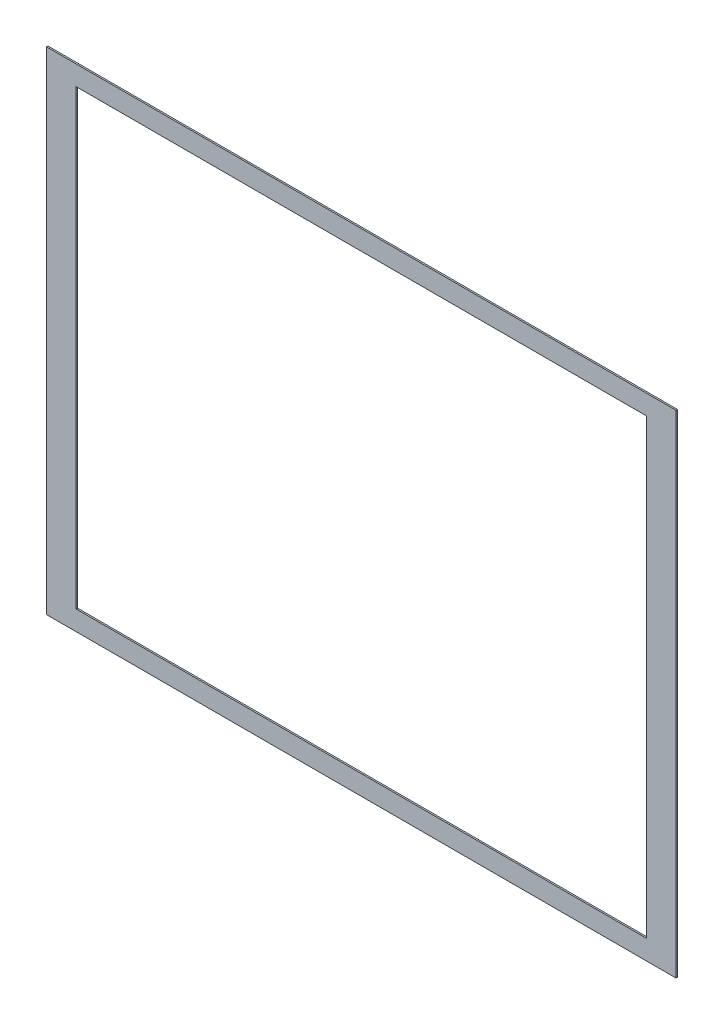
ISO-10303-21;
HEADER;
FILE_DESCRIPTION(('STEP AP214'),'2;1');
FILE_NAME('part.step','',(''),(''),'','','');
FILE_SCHEMA(('AUTOMOTIVE_DESIGN { 1 0 10303 214 1 1 1 1 }'));
ENDSEC;
DATA;
#1=APPLICATION_CONTEXT('core data for automotive mechanical design processes');
#2=APPLICATION_PROTOCOL_DEFINITION('international standard','automotive_design',2000,#1);
#3=PRODUCT_CONTEXT('',#1,'mechanical');
#4=PRODUCT('Part','Part','',(#3));
#5=PRODUCT_RELATED_PRODUCT_CATEGORY('part','',(#4));
#6=PRODUCT_DEFINITION_FORMATION('','',#4);
#7=PRODUCT_DEFINITION_CONTEXT('part definition',#1,'design');
#8=PRODUCT_DEFINITION('design','',#6,#7);
#9=PRODUCT_DEFINITION_SHAPE('','',#8);
#10=(LENGTH_UNIT() NAMED_UNIT(*) SI_UNIT(.MILLI.,.METRE.));
#11=(NAMED_UNIT(*) PLANE_ANGLE_UNIT() SI_UNIT($,.RADIAN.));
#12=(NAMED_UNIT(*) SI_UNIT($,.STERADIAN.) SOLID_ANGLE_UNIT());
#13=UNCERTAINTY_MEASURE_WITH_UNIT(LENGTH_MEASURE(1.E-05),#10,'distance_accuracy_value','');
#14=(GEOMETRIC_REPRESENTATION_CONTEXT(3) GLOBAL_UNCERTAINTY_ASSIGNED_CONTEXT((#13)) GLOBAL_UNIT_ASSIGNED_CONTEXT((#10,
#11,#12)) REPRESENTATION_CONTEXT('',''));
#15=CARTESIAN_POINT('',(0.,0.,0.));
#16=DIRECTION('',(0.,0.,1.));
#17=DIRECTION('',(1.,0.,0.));
#18=AXIS2_PLACEMENT_3D('',#15,#16,#17);
#19=CARTESIAN_POINT('',(0.,0.,40.));
#20=DIRECTION('',(0.,0.,-1.));
#21=DIRECTION('',(-1.,0.,0.));
#22=AXIS2_PLACEMENT_3D('',#19,#20,#21);
#23=PLANE('',#22);
#24=DIRECTION('',(0.,-1.,0.));
#25=VECTOR('',#24,1.);
#26=CARTESIAN_POINT('',(30.,320.,40.));
#27=LINE('',#26,#25);
#28=CARTESIAN_POINT('',(30.,820.,40.));
#29=VERTEX_POINT('',#28);
#30=CARTESIAN_POINT('',(30.,320.,40.));
#31=VERTEX_POINT('',#30);
#32=EDGE_CURVE('E126',#29,#31,#27,.T.);
#33=ORIENTED_EDGE('',*,*,#32,.T.);
#34=DIRECTION('',(1.,0.,0.));
#35=VECTOR('',#34,1.);
#36=CARTESIAN_POINT('',(30.,320.,40.));
#37=LINE('',#36,#35);
#38=CARTESIAN_POINT('',(670.,320.,40.));
#39=VERTEX_POINT('',#38);
#40=EDGE_CURVE('E129',#31,#39,#37,.T.);
#41=ORIENTED_EDGE('',*,*,#40,.T.);
#42=DIRECTION('',(0.,1.,0.));
#43=VECTOR('',#42,1.);
#44=CARTESIAN_POINT('',(670.,320.,40.));
#45=LINE('',#44,#43);
#46=CARTESIAN_POINT('',(670.,820.,40.));
#47=VERTEX_POINT('',#46);
#48=EDGE_CURVE('E132',#39,#47,#45,.T.);
#49=ORIENTED_EDGE('',*,*,#48,.T.);
#50=DIRECTION('',(-1.,0.,0.));
#51=VECTOR('',#50,1.);
#52=CARTESIAN_POINT('',(30.,820.,40.));
#53=LINE('',#52,#51);
#54=EDGE_CURVE('E134',#47,#29,#53,.T.);
#55=ORIENTED_EDGE('',*,*,#54,.T.);
#56=EDGE_LOOP('',(#33,#41,#49,#55));
#57=FACE_BOUND('',#56,.T.);
#58=DIRECTION('',(0.,-1.,0.));
#59=VECTOR('',#58,1.);
#60=CARTESIAN_POINT('',(60.,0.,40.));
#61=LINE('',#60,#59);
#62=CARTESIAN_POINT('',(60.,800.,40.));
#63=VERTEX_POINT('',#62);
#64=CARTESIAN_POINT('',(60.,340.,40.));
#65=VERTEX_POINT('',#64);
#66=EDGE_CURVE('E112',#63,#65,#61,.T.);
#67=ORIENTED_EDGE('',*,*,#66,.F.);
#68=DIRECTION('',(-1.,0.,0.));
#69=VECTOR('',#68,1.);
#70=CARTESIAN_POINT('',(0.,800.,40.));
#71=LINE('',#70,#69);
#72=CARTESIAN_POINT('',(640.,800.,40.));
#73=VERTEX_POINT('',#72);
#74=EDGE_CURVE('E101',#73,#63,#71,.T.);
#75=ORIENTED_EDGE('',*,*,#74,.F.);
#76=DIRECTION('',(0.,1.,0.));
#77=VECTOR('',#76,1.);
#78=CARTESIAN_POINT('',(640.,0.,40.));
#79=LINE('',#78,#77);
#80=CARTESIAN_POINT('',(640.,340.,40.));
#81=VERTEX_POINT('',#80);
#82=EDGE_CURVE('E106',#81,#73,#79,.T.);
#83=ORIENTED_EDGE('',*,*,#82,.F.);
#84=DIRECTION('',(1.,0.,0.));
#85=VECTOR('',#84,1.);
#86=CARTESIAN_POINT('',(0.,340.,40.));
#87=LINE('',#86,#85);
#88=EDGE_CURVE('E117',#65,#81,#87,.T.);
#89=ORIENTED_EDGE('',*,*,#88,.F.);
#90=EDGE_LOOP('',(#67,#75,#83,#89));
#91=FACE_BOUND('',#90,.T.);
#92=ADVANCED_FACE('F39',(#57,#91),#23,.F.);
#93=CARTESIAN_POINT('',(0.,0.,38.5));
#94=DIRECTION('',(0.,0.,-1.));
#95=DIRECTION('',(-1.,0.,0.));
#96=AXIS2_PLACEMENT_3D('',#93,#94,#95);
#97=PLANE('',#96);
#98=DIRECTION('',(0.,-1.,0.));
#99=VECTOR('',#98,1.);
#100=CARTESIAN_POINT('',(30.,320.,38.5));
#101=LINE('',#100,#99);
#102=CARTESIAN_POINT('',(30.,820.,38.5));
#103=VERTEX_POINT('',#102);
#104=CARTESIAN_POINT('',(30.,320.,38.5));
#105=VERTEX_POINT('',#104);
#106=EDGE_CURVE('E118',#103,#105,#101,.T.);
#107=ORIENTED_EDGE('',*,*,#106,.F.);
#108=DIRECTION('',(-1.,0.,0.));
#109=VECTOR('',#108,1.);
#110=CARTESIAN_POINT('',(30.,820.,38.5));
#111=LINE('',#110,#109);
#112=CARTESIAN_POINT('',(670.,820.,38.5));
#113=VERTEX_POINT('',#112);
#114=EDGE_CURVE('E130',#113,#103,#111,.T.);
#115=ORIENTED_EDGE('',*,*,#114,.F.);
#116=DIRECTION('',(0.,1.,0.));
#117=VECTOR('',#116,1.);
#118=CARTESIAN_POINT('',(670.,320.,38.5));
#119=LINE('',#118,#117);
#120=CARTESIAN_POINT('',(670.,320.,38.5));
#121=VERTEX_POINT('',#120);
#122=EDGE_CURVE('E138',#121,#113,#119,.T.);
#123=ORIENTED_EDGE('',*,*,#122,.F.);
#124=DIRECTION('',(1.,0.,0.));
#125=VECTOR('',#124,1.);
#126=CARTESIAN_POINT('',(30.,320.,38.5));
#127=LINE('',#126,#125);
#128=EDGE_CURVE('E121',#105,#121,#127,.T.);
#129=ORIENTED_EDGE('',*,*,#128,.F.);
#130=EDGE_LOOP('',(#107,#115,#123,#129));
#131=FACE_BOUND('',#130,.T.);
#132=DIRECTION('',(-1.,0.,0.));
#133=VECTOR('',#132,1.);
#134=CARTESIAN_POINT('',(0.,800.,38.5));
#135=LINE('',#134,#133);
#136=CARTESIAN_POINT('',(640.,800.,38.5));
#137=VERTEX_POINT('',#136);
#138=CARTESIAN_POINT('',(60.,800.,38.5));
#139=VERTEX_POINT('',#138);
#140=EDGE_CURVE('E152',#137,#139,#135,.T.);
#141=ORIENTED_EDGE('',*,*,#140,.T.);
#142=DIRECTION('',(0.,-1.,0.));
#143=VECTOR('',#142,1.);
#144=CARTESIAN_POINT('',(60.,0.,38.5));
#145=LINE('',#144,#143);
#146=CARTESIAN_POINT('',(60.,340.,38.5));
#147=VERTEX_POINT('',#146);
#148=EDGE_CURVE('E11',#139,#147,#145,.T.);
#149=ORIENTED_EDGE('',*,*,#148,.T.);
#150=DIRECTION('',(1.,0.,0.));
#151=VECTOR('',#150,1.);
#152=CARTESIAN_POINT('',(0.,340.,38.5));
#153=LINE('',#152,#151);
#154=CARTESIAN_POINT('',(640.,340.,38.5));
#155=VERTEX_POINT('',#154);
#156=EDGE_CURVE('E47',#147,#155,#153,.T.);
#157=ORIENTED_EDGE('',*,*,#156,.T.);
#158=DIRECTION('',(0.,1.,0.));
#159=VECTOR('',#158,1.);
#160=CARTESIAN_POINT('',(640.,0.,38.5));
#161=LINE('',#160,#159);
#162=EDGE_CURVE('E154',#155,#137,#161,.T.);
#163=ORIENTED_EDGE('',*,*,#162,.T.);
#164=EDGE_LOOP('',(#141,#149,#157,#163));
#165=FACE_BOUND('',#164,.T.);
#166=ADVANCED_FACE('F158',(#131,#165),#97,.T.);
#167=CARTESIAN_POINT('',(30.,320.,40.));
#168=DIRECTION('',(1.,0.,0.));
#169=DIRECTION('',(0.,0.,-1.));
#170=AXIS2_PLACEMENT_3D('',#167,#168,#169);
#171=PLANE('',#170);
#172=ORIENTED_EDGE('',*,*,#106,.T.);
#173=DIRECTION('',(0.,0.,-1.));
#174=VECTOR('',#173,1.);
#175=CARTESIAN_POINT('',(30.,320.,40.));
#176=LINE('',#175,#174);
#177=EDGE_CURVE('E149',#31,#105,#176,.T.);
#178=ORIENTED_EDGE('',*,*,#177,.F.);
#179=ORIENTED_EDGE('',*,*,#32,.F.);
#180=DIRECTION('',(0.,0.,-1.));
#181=VECTOR('',#180,1.);
#182=CARTESIAN_POINT('',(30.,820.,40.));
#183=LINE('',#182,#181);
#184=EDGE_CURVE('E135',#29,#103,#183,.T.);
#185=ORIENTED_EDGE('',*,*,#184,.T.);
#186=EDGE_LOOP('',(#172,#178,#179,#185));
#187=FACE_BOUND('',#186,.T.);
#188=ADVANCED_FACE('F41',(#187),#171,.F.);
#189=CARTESIAN_POINT('',(30.,320.,40.));
#190=DIRECTION('',(0.,1.,0.));
#191=DIRECTION('',(0.,0.,1.));
#192=AXIS2_PLACEMENT_3D('',#189,#190,#191);
#193=PLANE('',#192);
#194=ORIENTED_EDGE('',*,*,#128,.T.);
#195=DIRECTION('',(0.,0.,-1.));
#196=VECTOR('',#195,1.);
#197=CARTESIAN_POINT('',(670.,320.,40.));
#198=LINE('',#197,#196);
#199=EDGE_CURVE('E146',#39,#121,#198,.T.);
#200=ORIENTED_EDGE('',*,*,#199,.F.);
#201=ORIENTED_EDGE('',*,*,#40,.F.);
#202=ORIENTED_EDGE('',*,*,#177,.T.);
#203=EDGE_LOOP('',(#194,#200,#201,#202));
#204=FACE_BOUND('',#203,.T.);
#205=ADVANCED_FACE('F193',(#204),#193,.F.);
#206=CARTESIAN_POINT('',(670.,320.,40.));
#207=DIRECTION('',(-1.,0.,0.));
#208=DIRECTION('',(0.,0.,1.));
#209=AXIS2_PLACEMENT_3D('',#206,#207,#208);
#210=PLANE('',#209);
#211=ORIENTED_EDGE('',*,*,#122,.T.);
#212=DIRECTION('',(0.,0.,-1.));
#213=VECTOR('',#212,1.);
#214=CARTESIAN_POINT('',(670.,820.,40.));
#215=LINE('',#214,#213);
#216=EDGE_CURVE('E143',#47,#113,#215,.T.);
#217=ORIENTED_EDGE('',*,*,#216,.F.);
#218=ORIENTED_EDGE('',*,*,#48,.F.);
#219=ORIENTED_EDGE('',*,*,#199,.T.);
#220=EDGE_LOOP('',(#211,#217,#218,#219));
#221=FACE_BOUND('',#220,.T.);
#222=ADVANCED_FACE('F190',(#221),#210,.F.);
#223=CARTESIAN_POINT('',(30.,820.,40.));
#224=DIRECTION('',(0.,-1.,0.));
#225=DIRECTION('',(0.,0.,-1.));
#226=AXIS2_PLACEMENT_3D('',#223,#224,#225);
#227=PLANE('',#226);
#228=ORIENTED_EDGE('',*,*,#114,.T.);
#229=ORIENTED_EDGE('',*,*,#184,.F.);
#230=ORIENTED_EDGE('',*,*,#54,.F.);
#231=ORIENTED_EDGE('',*,*,#216,.T.);
#232=EDGE_LOOP('',(#228,#229,#230,#231));
#233=FACE_BOUND('',#232,.T.);
#234=ADVANCED_FACE('F188',(#233),#227,.F.);
#235=CARTESIAN_POINT('',(60.,340.,41.));
#236=DIRECTION('',(1.,0.,0.));
#237=DIRECTION('',(0.,0.,-1.));
#238=AXIS2_PLACEMENT_3D('',#235,#236,#237);
#239=PLANE('',#238);
#240=ORIENTED_EDGE('',*,*,#66,.T.);
#241=DIRECTION('',(0.,0.,-1.));
#242=VECTOR('',#241,1.);
#243=CARTESIAN_POINT('',(60.,340.,41.));
#244=LINE('',#243,#242);
#245=EDGE_CURVE('E107',#65,#147,#244,.T.);
#246=ORIENTED_EDGE('',*,*,#245,.T.);
#247=ORIENTED_EDGE('',*,*,#148,.F.);
#248=DIRECTION('',(0.,0.,-1.));
#249=VECTOR('',#248,1.);
#250=CARTESIAN_POINT('',(60.,800.,41.));
#251=LINE('',#250,#249);
#252=EDGE_CURVE('E59',#63,#139,#251,.T.);
#253=ORIENTED_EDGE('',*,*,#252,.F.);
#254=EDGE_LOOP('',(#240,#246,#247,#253));
#255=FACE_BOUND('',#254,.T.);
#256=ADVANCED_FACE('F110',(#255),#239,.T.);
#257=CARTESIAN_POINT('',(60.,340.,41.));
#258=DIRECTION('',(0.,1.,0.));
#259=DIRECTION('',(0.,0.,1.));
#260=AXIS2_PLACEMENT_3D('',#257,#258,#259);
#261=PLANE('',#260);
#262=ORIENTED_EDGE('',*,*,#88,.T.);
#263=DIRECTION('',(0.,0.,-1.));
#264=VECTOR('',#263,1.);
#265=CARTESIAN_POINT('',(640.,340.,41.));
#266=LINE('',#265,#264);
#267=EDGE_CURVE('E163',#81,#155,#266,.T.);
#268=ORIENTED_EDGE('',*,*,#267,.T.);
#269=ORIENTED_EDGE('',*,*,#156,.F.);
#270=ORIENTED_EDGE('',*,*,#245,.F.);
#271=EDGE_LOOP('',(#262,#268,#269,#270));
#272=FACE_BOUND('',#271,.T.);
#273=ADVANCED_FACE('F161',(#272),#261,.T.);
#274=CARTESIAN_POINT('',(640.,340.,41.));
#275=DIRECTION('',(-1.,0.,0.));
#276=DIRECTION('',(0.,0.,1.));
#277=AXIS2_PLACEMENT_3D('',#274,#275,#276);
#278=PLANE('',#277);
#279=ORIENTED_EDGE('',*,*,#82,.T.);
#280=DIRECTION('',(0.,0.,-1.));
#281=VECTOR('',#280,1.);
#282=CARTESIAN_POINT('',(640.,800.,41.));
#283=LINE('',#282,#281);
#284=EDGE_CURVE('E54',#73,#137,#283,.T.);
#285=ORIENTED_EDGE('',*,*,#284,.T.);
#286=ORIENTED_EDGE('',*,*,#162,.F.);
#287=ORIENTED_EDGE('',*,*,#267,.F.);
#288=EDGE_LOOP('',(#279,#285,#286,#287));
#289=FACE_BOUND('',#288,.T.);
#290=ADVANCED_FACE('F168',(#289),#278,.T.);
#291=CARTESIAN_POINT('',(60.,800.,41.));
#292=DIRECTION('',(0.,-1.,0.));
#293=DIRECTION('',(0.,0.,-1.));
#294=AXIS2_PLACEMENT_3D('',#291,#292,#293);
#295=PLANE('',#294);
#296=ORIENTED_EDGE('',*,*,#74,.T.);
#297=ORIENTED_EDGE('',*,*,#252,.T.);
#298=ORIENTED_EDGE('',*,*,#140,.F.);
#299=ORIENTED_EDGE('',*,*,#284,.F.);
#300=EDGE_LOOP('',(#296,#297,#298,#299));
#301=FACE_BOUND('',#300,.T.);
#302=ADVANCED_FACE('F102',(#301),#295,.T.);
#303=CLOSED_SHELL('',(#92,#166,#188,#205,#222,#234,#256,#273,#290,#302));
#304=MANIFOLD_SOLID_BREP('B2',#303);
#305=ADVANCED_BREP_SHAPE_REPRESENTATION('',(#18,#304),#14);
#306=SHAPE_DEFINITION_REPRESENTATION(#9,#305);
ENDSEC;
END-ISO-10303-21;
